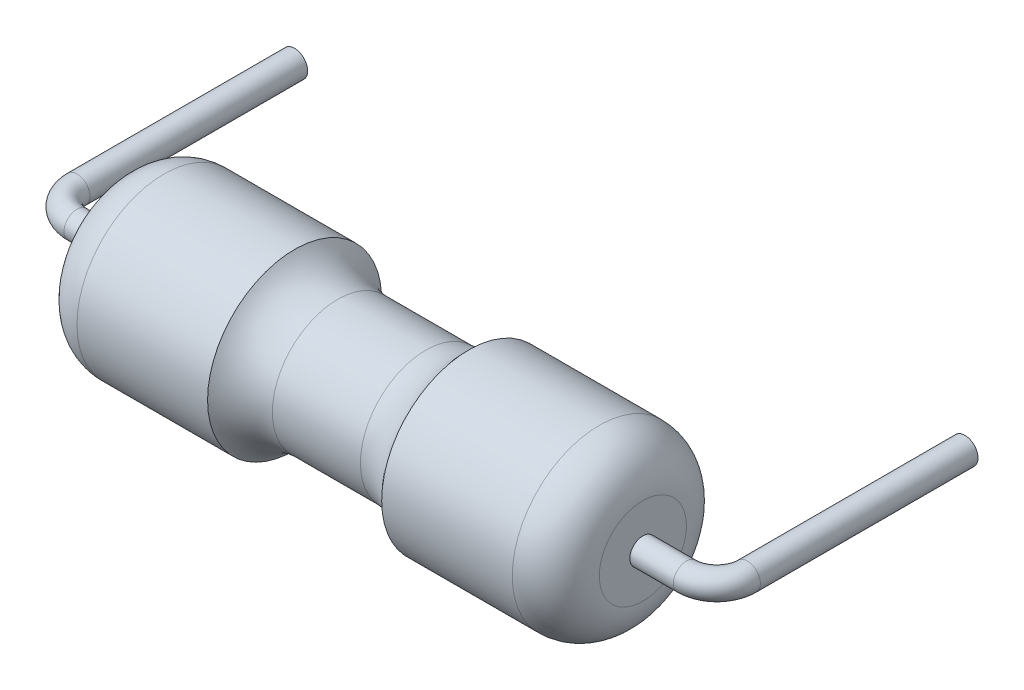
ISO-10303-21;
HEADER;
FILE_DESCRIPTION(('STEP AP214'),'2;1');
FILE_NAME('part.step','',(''),(''),'','','');
FILE_SCHEMA(('AUTOMOTIVE_DESIGN { 1 0 10303 214 1 1 1 1 }'));
ENDSEC;
DATA;
#1=APPLICATION_CONTEXT('core data for automotive mechanical design processes');
#2=APPLICATION_PROTOCOL_DEFINITION('international standard','automotive_design',2000,#1);
#3=PRODUCT_CONTEXT('',#1,'mechanical');
#4=PRODUCT('Part','Part','',(#3));
#5=PRODUCT_RELATED_PRODUCT_CATEGORY('part','',(#4));
#6=PRODUCT_DEFINITION_FORMATION('','',#4);
#7=PRODUCT_DEFINITION_CONTEXT('part definition',#1,'design');
#8=PRODUCT_DEFINITION('design','',#6,#7);
#9=PRODUCT_DEFINITION_SHAPE('','',#8);
#10=(LENGTH_UNIT() NAMED_UNIT(*) SI_UNIT(.MILLI.,.METRE.));
#11=(NAMED_UNIT(*) PLANE_ANGLE_UNIT() SI_UNIT($,.RADIAN.));
#12=(NAMED_UNIT(*) SI_UNIT($,.STERADIAN.) SOLID_ANGLE_UNIT());
#13=UNCERTAINTY_MEASURE_WITH_UNIT(LENGTH_MEASURE(1.E-05),#10,'distance_accuracy_value','');
#14=(GEOMETRIC_REPRESENTATION_CONTEXT(3) GLOBAL_UNCERTAINTY_ASSIGNED_CONTEXT((#13)) GLOBAL_UNIT_ASSIGNED_CONTEXT((#10,
#11,#12)) REPRESENTATION_CONTEXT('',''));
#15=CARTESIAN_POINT('',(0.,0.,0.));
#16=DIRECTION('',(0.,0.,1.));
#17=DIRECTION('',(1.,0.,0.));
#18=AXIS2_PLACEMENT_3D('',#15,#16,#17);
#19=CARTESIAN_POINT('',(2.99999999999471,0.499999999996468,0.));
#20=DIRECTION('',(-1.,0.,0.));
#21=DIRECTION('',(0.,0.,1.));
#22=AXIS2_PLACEMENT_3D('',#19,#20,#21);
#23=PLANE('',#22);
#24=CARTESIAN_POINT('',(2.99999999999656,0.,0.));
#25=DIRECTION('',(-1.,0.,0.));
#26=DIRECTION('',(0.,0.,1.));
#27=AXIS2_PLACEMENT_3D('',#24,#25,#26);
#28=CIRCLE('',#27,0.499999999996468);
#29=CARTESIAN_POINT('',(2.99999999999656,0.,0.499999999996468));
#30=VERTEX_POINT('',#29);
#31=EDGE_CURVE('E56',#30,#30,#28,.T.);
#32=ORIENTED_EDGE('',*,*,#31,.F.);
#33=EDGE_LOOP('',(#32));
#34=FACE_BOUND('',#33,.T.);
#35=CARTESIAN_POINT('',(2.99999999999471,0.,0.));
#36=DIRECTION('',(1.,0.,0.));
#37=DIRECTION('',(0.,0.,-1.));
#38=AXIS2_PLACEMENT_3D('',#35,#36,#37);
#39=CIRCLE('',#38,0.15);
#40=CARTESIAN_POINT('',(2.99999999999471,0.,-0.15));
#41=VERTEX_POINT('',#40);
#42=EDGE_CURVE('E10',#41,#41,#39,.T.);
#43=ORIENTED_EDGE('',*,*,#42,.F.);
#44=EDGE_LOOP('',(#43));
#45=FACE_BOUND('',#44,.T.);
#46=ADVANCED_FACE('F33',(#34,#45),#23,.F.);
#47=CARTESIAN_POINT('',(-2.99999999999472,0.499999999996468,0.));
#48=DIRECTION('',(1.,0.,0.));
#49=DIRECTION('',(0.,0.,-1.));
#50=AXIS2_PLACEMENT_3D('',#47,#48,#49);
#51=PLANE('',#50);
#52=CARTESIAN_POINT('',(-2.99999999999471,0.,0.));
#53=DIRECTION('',(1.,0.,0.));
#54=DIRECTION('',(0.,0.,-1.));
#55=AXIS2_PLACEMENT_3D('',#52,#53,#54);
#56=CIRCLE('',#55,0.15);
#57=CARTESIAN_POINT('',(-2.99999999999471,0.,-0.15));
#58=VERTEX_POINT('',#57);
#59=EDGE_CURVE('E293',#58,#58,#56,.T.);
#60=ORIENTED_EDGE('',*,*,#59,.T.);
#61=EDGE_LOOP('',(#60));
#62=FACE_BOUND('',#61,.T.);
#63=CARTESIAN_POINT('',(-2.99999999999645,0.,0.));
#64=DIRECTION('',(-1.,0.,0.));
#65=DIRECTION('',(0.,0.,1.));
#66=AXIS2_PLACEMENT_3D('',#63,#64,#65);
#67=CIRCLE('',#66,0.499999999996468);
#68=CARTESIAN_POINT('',(-2.99999999999645,0.,0.499999999996468));
#69=VERTEX_POINT('',#68);
#70=EDGE_CURVE('E37',#69,#69,#67,.T.);
#71=ORIENTED_EDGE('',*,*,#70,.T.);
#72=EDGE_LOOP('',(#71));
#73=FACE_BOUND('',#72,.T.);
#74=ADVANCED_FACE('F35',(#62,#73),#51,.F.);
#75=CARTESIAN_POINT('',(-2.49999999999648,0.,0.));
#76=DIRECTION('',(-1.,0.,0.));
#77=DIRECTION('',(0.,0.,1.));
#78=AXIS2_PLACEMENT_3D('',#75,#76,#77);
#79=DEGENERATE_TOROIDAL_SURFACE('',#78,0.499999999999999,0.5,.T.);
#80=ORIENTED_EDGE('',*,*,#70,.F.);
#81=EDGE_LOOP('',(#80));
#82=FACE_BOUND('',#81,.T.);
#83=CARTESIAN_POINT('',(-2.49999999999651,0.,0.));
#84=DIRECTION('',(-1.,0.,0.));
#85=DIRECTION('',(0.,0.,1.));
#86=AXIS2_PLACEMENT_3D('',#83,#84,#85);
#87=CIRCLE('',#86,0.999999999999999);
#88=CARTESIAN_POINT('',(-2.49999999999651,0.,0.999999999999999));
#89=VERTEX_POINT('',#88);
#90=EDGE_CURVE('E45',#89,#89,#87,.T.);
#91=ORIENTED_EDGE('',*,*,#90,.T.);
#92=EDGE_LOOP('',(#91));
#93=FACE_BOUND('',#92,.T.);
#94=ADVANCED_FACE('F76',(#82,#93),#79,.T.);
#95=CARTESIAN_POINT('',(-1000.,0.,0.));
#96=DIRECTION('',(-1.,0.,0.));
#97=DIRECTION('',(0.,0.,1.));
#98=AXIS2_PLACEMENT_3D('',#95,#96,#97);
#99=CYLINDRICAL_SURFACE('',#98,0.999999999999999);
#100=ORIENTED_EDGE('',*,*,#90,.F.);
#101=EDGE_LOOP('',(#100));
#102=FACE_BOUND('',#101,.T.);
#103=CARTESIAN_POINT('',(-1.,0.,0.));
#104=DIRECTION('',(-1.,0.,0.));
#105=DIRECTION('',(0.,0.,1.));
#106=AXIS2_PLACEMENT_3D('',#103,#104,#105);
#107=CIRCLE('',#106,0.999999999999999);
#108=CARTESIAN_POINT('',(-1.,0.,0.999999999999999));
#109=VERTEX_POINT('',#108);
#110=EDGE_CURVE('E71',#109,#109,#107,.T.);
#111=ORIENTED_EDGE('',*,*,#110,.T.);
#112=EDGE_LOOP('',(#111));
#113=FACE_BOUND('',#112,.T.);
#114=ADVANCED_FACE('F78',(#102,#113),#99,.T.);
#115=CARTESIAN_POINT('',(-0.488061579313341,0.,0.));
#116=DIRECTION('',(-1.,0.,0.));
#117=DIRECTION('',(0.,0.,1.));
#118=AXIS2_PLACEMENT_3D('',#115,#116,#117);
#119=TOROIDAL_SURFACE('',#118,1.39854429629174,0.648782323034345);
#120=ORIENTED_EDGE('',*,*,#110,.F.);
#121=EDGE_LOOP('',(#120));
#122=FACE_BOUND('',#121,.T.);
#123=CARTESIAN_POINT('',(-0.50563424073069,0.,0.));
#124=DIRECTION('',(-1.,0.,0.));
#125=DIRECTION('',(0.,0.,1.));
#126=AXIS2_PLACEMENT_3D('',#123,#124,#125);
#127=CIRCLE('',#126,0.75);
#128=CARTESIAN_POINT('',(-0.50563424073069,0.,0.75));
#129=VERTEX_POINT('',#128);
#130=EDGE_CURVE('E68',#129,#129,#127,.T.);
#131=ORIENTED_EDGE('',*,*,#130,.T.);
#132=EDGE_LOOP('',(#131));
#133=FACE_BOUND('',#132,.T.);
#134=ADVANCED_FACE('F81',(#122,#133),#119,.F.);
#135=CARTESIAN_POINT('',(-1000.,0.,0.));
#136=DIRECTION('',(-1.,0.,0.));
#137=DIRECTION('',(0.,0.,1.));
#138=AXIS2_PLACEMENT_3D('',#135,#136,#137);
#139=CYLINDRICAL_SURFACE('',#138,0.75);
#140=ORIENTED_EDGE('',*,*,#130,.F.);
#141=EDGE_LOOP('',(#140));
#142=FACE_BOUND('',#141,.T.);
#143=CARTESIAN_POINT('',(0.505634240730579,0.,0.));
#144=DIRECTION('',(-1.,0.,0.));
#145=DIRECTION('',(0.,0.,1.));
#146=AXIS2_PLACEMENT_3D('',#143,#144,#145);
#147=CIRCLE('',#146,0.749999999999999);
#148=CARTESIAN_POINT('',(0.505634240730579,0.,0.749999999999999));
#149=VERTEX_POINT('',#148);
#150=EDGE_CURVE('E65',#149,#149,#147,.T.);
#151=ORIENTED_EDGE('',*,*,#150,.T.);
#152=EDGE_LOOP('',(#151));
#153=FACE_BOUND('',#152,.T.);
#154=ADVANCED_FACE('F87',(#142,#153),#139,.T.);
#155=CARTESIAN_POINT('',(0.488061579313331,0.,0.));
#156=DIRECTION('',(-1.,0.,0.));
#157=DIRECTION('',(0.,0.,1.));
#158=AXIS2_PLACEMENT_3D('',#155,#156,#157);
#159=TOROIDAL_SURFACE('',#158,1.39854429629174,0.648782323034346);
#160=ORIENTED_EDGE('',*,*,#150,.F.);
#161=EDGE_LOOP('',(#160));
#162=FACE_BOUND('',#161,.T.);
#163=CARTESIAN_POINT('',(0.99999999999989,0.,0.));
#164=DIRECTION('',(-1.,0.,0.));
#165=DIRECTION('',(0.,0.,1.));
#166=AXIS2_PLACEMENT_3D('',#163,#164,#165);
#167=CIRCLE('',#166,0.999999999999999);
#168=CARTESIAN_POINT('',(0.99999999999989,0.,0.999999999999999));
#169=VERTEX_POINT('',#168);
#170=EDGE_CURVE('E62',#169,#169,#167,.T.);
#171=ORIENTED_EDGE('',*,*,#170,.T.);
#172=EDGE_LOOP('',(#171));
#173=FACE_BOUND('',#172,.T.);
#174=ADVANCED_FACE('F93',(#162,#173),#159,.F.);
#175=CARTESIAN_POINT('',(-1000.,0.,0.));
#176=DIRECTION('',(-1.,0.,0.));
#177=DIRECTION('',(0.,0.,1.));
#178=AXIS2_PLACEMENT_3D('',#175,#176,#177);
#179=CYLINDRICAL_SURFACE('',#178,0.999999999999999);
#180=ORIENTED_EDGE('',*,*,#170,.F.);
#181=EDGE_LOOP('',(#180));
#182=FACE_BOUND('',#181,.T.);
#183=CARTESIAN_POINT('',(2.49999999999639,0.,0.));
#184=DIRECTION('',(-1.,0.,0.));
#185=DIRECTION('',(0.,0.,1.));
#186=AXIS2_PLACEMENT_3D('',#183,#184,#185);
#187=CIRCLE('',#186,0.999999999999999);
#188=CARTESIAN_POINT('',(2.49999999999639,0.,0.999999999999999));
#189=VERTEX_POINT('',#188);
#190=EDGE_CURVE('E59',#189,#189,#187,.T.);
#191=ORIENTED_EDGE('',*,*,#190,.T.);
#192=EDGE_LOOP('',(#191));
#193=FACE_BOUND('',#192,.T.);
#194=ADVANCED_FACE('F99',(#182,#193),#179,.T.);
#195=CARTESIAN_POINT('',(2.49999999999648,0.,0.));
#196=DIRECTION('',(-1.,0.,0.));
#197=DIRECTION('',(0.,0.,1.));
#198=AXIS2_PLACEMENT_3D('',#195,#196,#197);
#199=DEGENERATE_TOROIDAL_SURFACE('',#198,0.499999999999999,0.5,.T.);
#200=ORIENTED_EDGE('',*,*,#190,.F.);
#201=EDGE_LOOP('',(#200));
#202=FACE_BOUND('',#201,.T.);
#203=ORIENTED_EDGE('',*,*,#31,.T.);
#204=EDGE_LOOP('',(#203));
#205=FACE_BOUND('',#204,.T.);
#206=ADVANCED_FACE('F105',(#202,#205),#199,.T.);
#207=CARTESIAN_POINT('',(3.84999999999471,0.,-0.349999999998154));
#208=DIRECTION('',(0.,0.,-1.));
#209=DIRECTION('',(-1.,0.,0.));
#210=AXIS2_PLACEMENT_3D('',#207,#208,#209);
#211=CYLINDRICAL_SURFACE('',#210,0.15);
#212=CARTESIAN_POINT('',(3.84999999999471,0.,-0.349999999998154));
#213=DIRECTION('',(0.,0.,-1.));
#214=DIRECTION('',(-1.,0.,0.));
#215=AXIS2_PLACEMENT_3D('',#212,#213,#214);
#216=CIRCLE('',#215,0.15);
#217=CARTESIAN_POINT('',(3.99999999999471,0.,-0.349999999997363));
#218=VERTEX_POINT('',#217);
#219=EDGE_CURVE('E50',#218,#218,#216,.T.);
#220=ORIENTED_EDGE('',*,*,#219,.T.);
#221=EDGE_LOOP('',(#220));
#222=FACE_BOUND('',#221,.T.);
#223=CARTESIAN_POINT('',(3.84999999999471,0.,-2.84999999999815));
#224=DIRECTION('',(0.,0.,-1.));
#225=DIRECTION('',(-1.,0.,0.));
#226=AXIS2_PLACEMENT_3D('',#223,#224,#225);
#227=CIRCLE('',#226,0.15);
#228=CARTESIAN_POINT('',(3.69999999999471,0.,-2.84999999999815));
#229=VERTEX_POINT('',#228);
#230=EDGE_CURVE('E53',#229,#229,#227,.T.);
#231=ORIENTED_EDGE('',*,*,#230,.F.);
#232=EDGE_LOOP('',(#231));
#233=FACE_BOUND('',#232,.T.);
#234=ADVANCED_FACE('F111',(#222,#233),#211,.T.);
#235=CARTESIAN_POINT('',(3.49999999999471,0.,-0.35));
#236=DIRECTION('',(0.,1.,0.));
#237=DIRECTION('',(0.,0.,1.));
#238=AXIS2_PLACEMENT_3D('',#235,#236,#237);
#239=TOROIDAL_SURFACE('',#238,0.35,0.15);
#240=CARTESIAN_POINT('',(3.49999999999286,0.,0.));
#241=DIRECTION('',(1.,0.,0.));
#242=DIRECTION('',(0.,0.,-1.));
#243=AXIS2_PLACEMENT_3D('',#240,#241,#242);
#244=CIRCLE('',#243,0.15);
#245=CARTESIAN_POINT('',(3.49999999999207,0.,0.15));
#246=VERTEX_POINT('',#245);
#247=EDGE_CURVE('E48',#246,#246,#244,.T.);
#248=CARTESIAN_POINT('',(3.49999999999471,0.,-0.35));
#249=DIRECTION('',(0.,1.,0.));
#250=DIRECTION('',(0.,0.,1.));
#251=AXIS2_PLACEMENT_3D('',#248,#249,#250);
#252=CIRCLE('',#251,0.5);
#253=EDGE_CURVE('',#246,#218,#252,.T.);
#254=ORIENTED_EDGE('',*,*,#247,.T.);
#255=ORIENTED_EDGE('',*,*,#219,.F.);
#256=ORIENTED_EDGE('',*,*,#253,.T.);
#257=ORIENTED_EDGE('',*,*,#253,.F.);
#258=EDGE_LOOP('',(#254,#256,#255,#257));
#259=FACE_BOUND('',#258,.T.);
#260=ADVANCED_FACE('F162',(#259),#239,.T.);
#261=CARTESIAN_POINT('',(3.49999999999286,0.,0.));
#262=DIRECTION('',(-1.,0.,0.));
#263=DIRECTION('',(0.,0.,1.));
#264=AXIS2_PLACEMENT_3D('',#261,#262,#263);
#265=CYLINDRICAL_SURFACE('',#264,0.15);
#266=ORIENTED_EDGE('',*,*,#247,.F.);
#267=EDGE_LOOP('',(#266));
#268=FACE_BOUND('',#267,.T.);
#269=ORIENTED_EDGE('',*,*,#42,.T.);
#270=EDGE_LOOP('',(#269));
#271=FACE_BOUND('',#270,.T.);
#272=ADVANCED_FACE('F169',(#268,#271),#265,.T.);
#273=CARTESIAN_POINT('',(3.84999999999471,0.,-2.84999999999815));
#274=DIRECTION('',(0.,0.,-1.));
#275=DIRECTION('',(-1.,0.,0.));
#276=AXIS2_PLACEMENT_3D('',#273,#274,#275);
#277=PLANE('',#276);
#278=ORIENTED_EDGE('',*,*,#230,.T.);
#279=EDGE_LOOP('',(#278));
#280=FACE_BOUND('',#279,.T.);
#281=ADVANCED_FACE('F176',(#280),#277,.T.);
#282=CARTESIAN_POINT('',(-3.84999999999471,0.,-0.349999999998154));
#283=DIRECTION('',(0.,0.,-1.));
#284=DIRECTION('',(-1.,0.,0.));
#285=AXIS2_PLACEMENT_3D('',#282,#283,#284);
#286=CYLINDRICAL_SURFACE('',#285,0.15);
#287=CARTESIAN_POINT('',(-3.84999999999471,0.,-0.349999999998154));
#288=DIRECTION('',(0.,0.,1.));
#289=DIRECTION('',(1.,0.,0.));
#290=AXIS2_PLACEMENT_3D('',#287,#288,#289);
#291=CIRCLE('',#290,0.15);
#292=CARTESIAN_POINT('',(-3.99999999999471,0.,-0.349999999997363));
#293=VERTEX_POINT('',#292);
#294=EDGE_CURVE('E287',#293,#293,#291,.T.);
#295=ORIENTED_EDGE('',*,*,#294,.F.);
#296=EDGE_LOOP('',(#295));
#297=FACE_BOUND('',#296,.T.);
#298=CARTESIAN_POINT('',(-3.84999999999471,0.,-2.84999999999815));
#299=DIRECTION('',(0.,0.,1.));
#300=DIRECTION('',(1.,0.,0.));
#301=AXIS2_PLACEMENT_3D('',#298,#299,#300);
#302=CIRCLE('',#301,0.15);
#303=CARTESIAN_POINT('',(-3.69999999999471,0.,-2.84999999999815));
#304=VERTEX_POINT('',#303);
#305=EDGE_CURVE('E285',#304,#304,#302,.T.);
#306=ORIENTED_EDGE('',*,*,#305,.T.);
#307=EDGE_LOOP('',(#306));
#308=FACE_BOUND('',#307,.T.);
#309=ADVANCED_FACE('F185',(#297,#308),#286,.T.);
#310=CARTESIAN_POINT('',(-3.49999999999471,0.,-0.35));
#311=DIRECTION('',(0.,-1.,0.));
#312=DIRECTION('',(0.,0.,-1.));
#313=AXIS2_PLACEMENT_3D('',#310,#311,#312);
#314=TOROIDAL_SURFACE('',#313,0.35,0.15);
#315=CARTESIAN_POINT('',(-3.49999999999286,0.,0.));
#316=DIRECTION('',(1.,0.,0.));
#317=DIRECTION('',(0.,0.,-1.));
#318=AXIS2_PLACEMENT_3D('',#315,#316,#317);
#319=CIRCLE('',#318,0.15);
#320=CARTESIAN_POINT('',(-3.49999999999207,0.,0.15));
#321=VERTEX_POINT('',#320);
#322=EDGE_CURVE('E290',#321,#321,#319,.T.);
#323=CARTESIAN_POINT('',(-3.49999999999471,0.,-0.35));
#324=DIRECTION('',(0.,-1.,0.));
#325=DIRECTION('',(0.,0.,-1.));
#326=AXIS2_PLACEMENT_3D('',#323,#324,#325);
#327=CIRCLE('',#326,0.5);
#328=EDGE_CURVE('',#321,#293,#327,.T.);
#329=ORIENTED_EDGE('',*,*,#322,.F.);
#330=ORIENTED_EDGE('',*,*,#294,.T.);
#331=ORIENTED_EDGE('',*,*,#328,.T.);
#332=ORIENTED_EDGE('',*,*,#328,.F.);
#333=EDGE_LOOP('',(#329,#331,#330,#332));
#334=FACE_BOUND('',#333,.T.);
#335=ADVANCED_FACE('F193',(#334),#314,.T.);
#336=CARTESIAN_POINT('',(-3.49999999999286,0.,0.));
#337=DIRECTION('',(1.,0.,0.));
#338=DIRECTION('',(0.,0.,-1.));
#339=AXIS2_PLACEMENT_3D('',#336,#337,#338);
#340=CYLINDRICAL_SURFACE('',#339,0.15);
#341=ORIENTED_EDGE('',*,*,#322,.T.);
#342=EDGE_LOOP('',(#341));
#343=FACE_BOUND('',#342,.T.);
#344=ORIENTED_EDGE('',*,*,#59,.F.);
#345=EDGE_LOOP('',(#344));
#346=FACE_BOUND('',#345,.T.);
#347=ADVANCED_FACE('F201',(#343,#346),#340,.T.);
#348=CARTESIAN_POINT('',(-3.84999999999471,0.,-2.84999999999815));
#349=DIRECTION('',(0.,0.,-1.));
#350=DIRECTION('',(1.,0.,0.));
#351=AXIS2_PLACEMENT_3D('',#348,#349,#350);
#352=PLANE('',#351);
#353=ORIENTED_EDGE('',*,*,#305,.F.);
#354=EDGE_LOOP('',(#353));
#355=FACE_BOUND('',#354,.T.);
#356=ADVANCED_FACE('F208',(#355),#352,.T.);
#357=CLOSED_SHELL('',(#46,#74,#94,#114,#134,#154,#174,#194,#206,#234,#260,#272,#281,#309,#335,
#347,#356));
#358=MANIFOLD_SOLID_BREP('B2',#357);
#359=ADVANCED_BREP_SHAPE_REPRESENTATION('',(#18,#358),#14);
#360=SHAPE_DEFINITION_REPRESENTATION(#9,#359);
ENDSEC;
END-ISO-10303-21;
